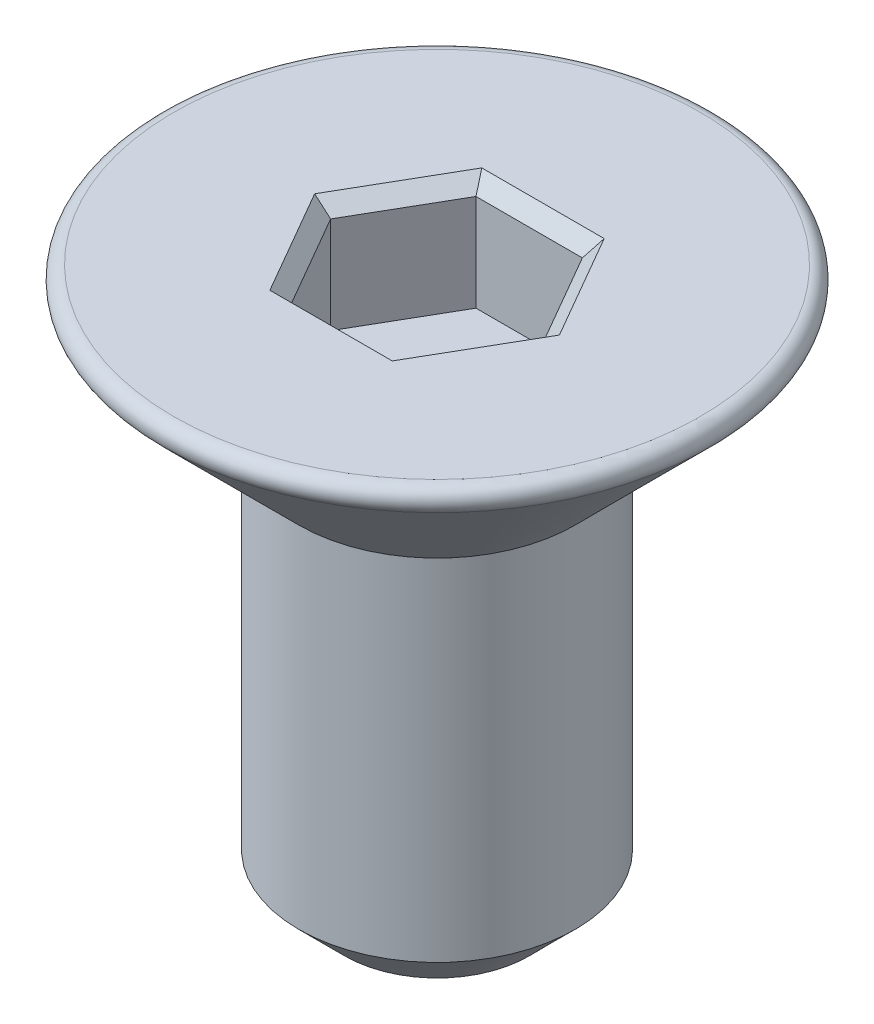
ISO-10303-21;
HEADER;
FILE_DESCRIPTION(('STEP AP214'),'2;1');
FILE_NAME('part.step','',(''),(''),'','','');
FILE_SCHEMA(('AUTOMOTIVE_DESIGN { 1 0 10303 214 1 1 1 1 }'));
ENDSEC;
DATA;
#1=APPLICATION_CONTEXT('core data for automotive mechanical design processes');
#2=APPLICATION_PROTOCOL_DEFINITION('international standard','automotive_design',2000,#1);
#3=PRODUCT_CONTEXT('',#1,'mechanical');
#4=PRODUCT('Part','Part','',(#3));
#5=PRODUCT_RELATED_PRODUCT_CATEGORY('part','',(#4));
#6=PRODUCT_DEFINITION_FORMATION('','',#4);
#7=PRODUCT_DEFINITION_CONTEXT('part definition',#1,'design');
#8=PRODUCT_DEFINITION('design','',#6,#7);
#9=PRODUCT_DEFINITION_SHAPE('','',#8);
#10=(LENGTH_UNIT() NAMED_UNIT(*) SI_UNIT(.MILLI.,.METRE.));
#11=(NAMED_UNIT(*) PLANE_ANGLE_UNIT() SI_UNIT($,.RADIAN.));
#12=(NAMED_UNIT(*) SI_UNIT($,.STERADIAN.) SOLID_ANGLE_UNIT());
#13=UNCERTAINTY_MEASURE_WITH_UNIT(LENGTH_MEASURE(1.E-05),#10,'distance_accuracy_value','');
#14=(GEOMETRIC_REPRESENTATION_CONTEXT(3) GLOBAL_UNCERTAINTY_ASSIGNED_CONTEXT((#13)) GLOBAL_UNIT_ASSIGNED_CONTEXT((#10,
#11,#12)) REPRESENTATION_CONTEXT('',''));
#15=CARTESIAN_POINT('',(0.,0.,0.));
#16=DIRECTION('',(0.,0.,1.));
#17=DIRECTION('',(1.,0.,0.));
#18=AXIS2_PLACEMENT_3D('',#15,#16,#17);
#19=CARTESIAN_POINT('',(0.,0.,0.));
#20=DIRECTION('',(0.,-1.,0.));
#21=DIRECTION('',(0.,0.,-1.));
#22=AXIS2_PLACEMENT_3D('',#19,#20,#21);
#23=PLANE('',#22);
#24=DIRECTION('',(-0.5,0.,-0.866025403784439));
#25=VECTOR('',#24,1.);
#26=CARTESIAN_POINT('',(-0.995929214352104,0.,0.575));
#27=LINE('',#26,#25);
#28=CARTESIAN_POINT('',(-0.663952809568069,0.,1.15));
#29=VERTEX_POINT('',#28);
#30=CARTESIAN_POINT('',(-1.32790561913614,0.,0.));
#31=VERTEX_POINT('',#30);
#32=EDGE_CURVE('E177',#29,#31,#27,.T.);
#33=ORIENTED_EDGE('',*,*,#32,.T.);
#34=DIRECTION('',(0.5,0.,-0.866025403784439));
#35=VECTOR('',#34,1.);
#36=CARTESIAN_POINT('',(-0.995929214352104,0.,-0.575));
#37=LINE('',#36,#35);
#38=CARTESIAN_POINT('',(-0.663952809568069,0.,-1.15));
#39=VERTEX_POINT('',#38);
#40=EDGE_CURVE('E179',#31,#39,#37,.T.);
#41=ORIENTED_EDGE('',*,*,#40,.T.);
#42=DIRECTION('',(1.,0.,0.));
#43=VECTOR('',#42,1.);
#44=CARTESIAN_POINT('',(0.,0.,-1.15));
#45=LINE('',#44,#43);
#46=CARTESIAN_POINT('',(0.66395280956807,0.,-1.15));
#47=VERTEX_POINT('',#46);
#48=EDGE_CURVE('E169',#39,#47,#45,.T.);
#49=ORIENTED_EDGE('',*,*,#48,.T.);
#50=DIRECTION('',(0.5,0.,0.866025403784439));
#51=VECTOR('',#50,1.);
#52=CARTESIAN_POINT('',(0.995929214352105,0.,-0.575));
#53=LINE('',#52,#51);
#54=CARTESIAN_POINT('',(1.32790561913614,0.,0.));
#55=VERTEX_POINT('',#54);
#56=EDGE_CURVE('E171',#47,#55,#53,.T.);
#57=ORIENTED_EDGE('',*,*,#56,.T.);
#58=DIRECTION('',(-0.5,0.,0.866025403784439));
#59=VECTOR('',#58,1.);
#60=CARTESIAN_POINT('',(0.995929214352105,0.,0.575));
#61=LINE('',#60,#59);
#62=CARTESIAN_POINT('',(0.66395280956807,0.,1.15));
#63=VERTEX_POINT('',#62);
#64=EDGE_CURVE('E173',#55,#63,#61,.T.);
#65=ORIENTED_EDGE('',*,*,#64,.T.);
#66=DIRECTION('',(-1.,0.,0.));
#67=VECTOR('',#66,1.);
#68=CARTESIAN_POINT('',(0.,0.,1.15));
#69=LINE('',#68,#67);
#70=EDGE_CURVE('E175',#63,#29,#69,.T.);
#71=ORIENTED_EDGE('',*,*,#70,.T.);
#72=EDGE_LOOP('',(#33,#41,#49,#57,#65,#71));
#73=FACE_BOUND('',#72,.T.);
#74=CARTESIAN_POINT('',(0.,0.,0.));
#75=DIRECTION('',(0.,1.,0.));
#76=DIRECTION('',(0.,0.,1.));
#77=AXIS2_PLACEMENT_3D('',#74,#75,#76);
#78=CIRCLE('',#77,2.85857864376269);
#79=CARTESIAN_POINT('',(0.,0.,2.85857864376269));
#80=VERTEX_POINT('',#79);
#81=EDGE_CURVE('E165',#80,#80,#78,.T.);
#82=ORIENTED_EDGE('',*,*,#81,.T.);
#83=EDGE_LOOP('',(#82));
#84=FACE_BOUND('',#83,.T.);
#85=ADVANCED_FACE('F35',(#73,#84),#23,.F.);
#86=CARTESIAN_POINT('',(0.,-0.141421356237313,0.));
#87=DIRECTION('',(0.,1.,0.));
#88=DIRECTION('',(0.,0.,1.));
#89=AXIS2_PLACEMENT_3D('',#86,#87,#88);
#90=TOROIDAL_SURFACE('',#89,2.85857864376269,0.141421356237313);
#91=ORIENTED_EDGE('',*,*,#81,.F.);
#92=EDGE_LOOP('',(#91));
#93=FACE_BOUND('',#92,.T.);
#94=CARTESIAN_POINT('',(0.,-0.241421356237315,0.));
#95=DIRECTION('',(0.,1.,0.));
#96=DIRECTION('',(0.,0.,1.));
#97=AXIS2_PLACEMENT_3D('',#94,#95,#96);
#98=CIRCLE('',#97,2.95857864376269);
#99=CARTESIAN_POINT('',(0.,-0.241421356237315,2.95857864376269));
#100=VERTEX_POINT('',#99);
#101=EDGE_CURVE('E162',#100,#100,#98,.T.);
#102=ORIENTED_EDGE('',*,*,#101,.T.);
#103=EDGE_LOOP('',(#102));
#104=FACE_BOUND('',#103,.T.);
#105=ADVANCED_FACE('F233',(#93,#104),#90,.T.);
#106=CARTESIAN_POINT('',(0.,-1.7,0.));
#107=DIRECTION('',(0.,1.,0.));
#108=DIRECTION('',(0.,0.,1.));
#109=AXIS2_PLACEMENT_3D('',#106,#107,#108);
#110=CONICAL_SURFACE('',#109,1.5,0.78539816339745);
#111=ORIENTED_EDGE('',*,*,#101,.F.);
#112=EDGE_LOOP('',(#111));
#113=FACE_BOUND('',#112,.T.);
#114=CARTESIAN_POINT('',(0.,-1.7,0.));
#115=DIRECTION('',(0.,1.,0.));
#116=DIRECTION('',(0.,0.,1.));
#117=AXIS2_PLACEMENT_3D('',#114,#115,#116);
#118=CIRCLE('',#117,1.5);
#119=CARTESIAN_POINT('',(0.,-1.7,1.5));
#120=VERTEX_POINT('',#119);
#121=EDGE_CURVE('E159',#120,#120,#118,.T.);
#122=ORIENTED_EDGE('',*,*,#121,.T.);
#123=EDGE_LOOP('',(#122));
#124=FACE_BOUND('',#123,.T.);
#125=ADVANCED_FACE('F239',(#113,#124),#110,.T.);
#126=CARTESIAN_POINT('',(0.,6.97297297297297,0.));
#127=DIRECTION('',(0.,1.,0.));
#128=DIRECTION('',(0.,0.,1.));
#129=AXIS2_PLACEMENT_3D('',#126,#127,#128);
#130=CYLINDRICAL_SURFACE('',#129,1.5);
#131=ORIENTED_EDGE('',*,*,#121,.F.);
#132=EDGE_LOOP('',(#131));
#133=FACE_BOUND('',#132,.T.);
#134=CARTESIAN_POINT('',(0.,-5.5,0.));
#135=DIRECTION('',(0.,1.,0.));
#136=DIRECTION('',(0.,0.,1.));
#137=AXIS2_PLACEMENT_3D('',#134,#135,#136);
#138=CIRCLE('',#137,1.5);
#139=CARTESIAN_POINT('',(0.,-5.5,1.5));
#140=VERTEX_POINT('',#139);
#141=EDGE_CURVE('E156',#140,#140,#138,.T.);
#142=ORIENTED_EDGE('',*,*,#141,.T.);
#143=EDGE_LOOP('',(#142));
#144=FACE_BOUND('',#143,.T.);
#145=ADVANCED_FACE('F360',(#133,#144),#130,.T.);
#146=CARTESIAN_POINT('',(0.,-6.,0.));
#147=DIRECTION('',(0.,1.,0.));
#148=DIRECTION('',(0.,0.,1.));
#149=AXIS2_PLACEMENT_3D('',#146,#147,#148);
#150=CONICAL_SURFACE('',#149,1.,0.785398163397448);
#151=ORIENTED_EDGE('',*,*,#141,.F.);
#152=EDGE_LOOP('',(#151));
#153=FACE_BOUND('',#152,.T.);
#154=CARTESIAN_POINT('',(0.,-6.,0.));
#155=DIRECTION('',(0.,1.,0.));
#156=DIRECTION('',(0.,0.,1.));
#157=AXIS2_PLACEMENT_3D('',#154,#155,#156);
#158=CIRCLE('',#157,1.);
#159=CARTESIAN_POINT('',(0.,-6.,1.));
#160=VERTEX_POINT('',#159);
#161=EDGE_CURVE('E146',#160,#160,#158,.T.);
#162=ORIENTED_EDGE('',*,*,#161,.T.);
#163=EDGE_LOOP('',(#162));
#164=FACE_BOUND('',#163,.T.);
#165=ADVANCED_FACE('F355',(#153,#164),#150,.T.);
#166=CARTESIAN_POINT('',(1.,-6.,0.));
#167=DIRECTION('',(0.,1.,0.));
#168=DIRECTION('',(0.,0.,1.));
#169=AXIS2_PLACEMENT_3D('',#166,#167,#168);
#170=PLANE('',#169);
#171=ORIENTED_EDGE('',*,*,#161,.F.);
#172=EDGE_LOOP('',(#171));
#173=FACE_BOUND('',#172,.T.);
#174=ADVANCED_FACE('F330',(#173),#170,.F.);
#175=CARTESIAN_POINT('',(-0.577350269189626,-1.2,-1.));
#176=DIRECTION('',(-0.866025403784439,0.,-0.5));
#177=DIRECTION('',(-0.5,0.,0.866025403784439));
#178=AXIS2_PLACEMENT_3D('',#175,#176,#177);
#179=PLANE('',#178);
#180=DIRECTION('',(0.,1.,0.));
#181=VECTOR('',#180,1.);
#182=CARTESIAN_POINT('',(-0.577350269189626,-1.2,-1.));
#183=LINE('',#182,#181);
#184=CARTESIAN_POINT('',(-0.577350269189626,-1.2,-1.));
#185=VERTEX_POINT('',#184);
#186=CARTESIAN_POINT('',(-0.577350269189626,-0.15,-1.));
#187=VERTEX_POINT('',#186);
#188=EDGE_CURVE('E144',#185,#187,#183,.T.);
#189=ORIENTED_EDGE('',*,*,#188,.T.);
#190=DIRECTION('',(-0.5,0.,0.866025403784439));
#191=VECTOR('',#190,1.);
#192=CARTESIAN_POINT('',(-0.577350269189626,-0.15,-1.));
#193=LINE('',#192,#191);
#194=CARTESIAN_POINT('',(-1.15470053837925,-0.15,0.));
#195=VERTEX_POINT('',#194);
#196=EDGE_CURVE('E116',#187,#195,#193,.T.);
#197=ORIENTED_EDGE('',*,*,#196,.T.);
#198=DIRECTION('',(0.,1.,0.));
#199=VECTOR('',#198,1.);
#200=CARTESIAN_POINT('',(-1.15470053837925,-1.2,0.));
#201=LINE('',#200,#199);
#202=CARTESIAN_POINT('',(-1.15470053837925,-1.2,0.));
#203=VERTEX_POINT('',#202);
#204=EDGE_CURVE('E108',#203,#195,#201,.T.);
#205=ORIENTED_EDGE('',*,*,#204,.F.);
#206=DIRECTION('',(-0.5,0.,0.866025403784439));
#207=VECTOR('',#206,1.);
#208=CARTESIAN_POINT('',(-0.577350269189626,-1.2,-1.));
#209=LINE('',#208,#207);
#210=EDGE_CURVE('E113',#185,#203,#209,.T.);
#211=ORIENTED_EDGE('',*,*,#210,.F.);
#212=EDGE_LOOP('',(#189,#197,#205,#211));
#213=FACE_BOUND('',#212,.T.);
#214=ADVANCED_FACE('F111',(#213),#179,.F.);
#215=CARTESIAN_POINT('',(0.577350269189626,-1.2,-1.));
#216=DIRECTION('',(0.,0.,-1.));
#217=DIRECTION('',(-1.,0.,0.));
#218=AXIS2_PLACEMENT_3D('',#215,#216,#217);
#219=PLANE('',#218);
#220=DIRECTION('',(0.,1.,0.));
#221=VECTOR('',#220,1.);
#222=CARTESIAN_POINT('',(0.577350269189626,-1.2,-1.));
#223=LINE('',#222,#221);
#224=CARTESIAN_POINT('',(0.577350269189626,-1.2,-1.));
#225=VERTEX_POINT('',#224);
#226=CARTESIAN_POINT('',(0.577350269189626,-0.15,-1.));
#227=VERTEX_POINT('',#226);
#228=EDGE_CURVE('E147',#225,#227,#223,.T.);
#229=ORIENTED_EDGE('',*,*,#228,.T.);
#230=DIRECTION('',(-1.,0.,0.));
#231=VECTOR('',#230,1.);
#232=CARTESIAN_POINT('',(0.577350269189626,-0.15,-1.));
#233=LINE('',#232,#231);
#234=EDGE_CURVE('E11',#227,#187,#233,.T.);
#235=ORIENTED_EDGE('',*,*,#234,.T.);
#236=ORIENTED_EDGE('',*,*,#188,.F.);
#237=DIRECTION('',(-1.,0.,0.));
#238=VECTOR('',#237,1.);
#239=CARTESIAN_POINT('',(0.577350269189626,-1.2,-1.));
#240=LINE('',#239,#238);
#241=EDGE_CURVE('E119',#225,#185,#240,.T.);
#242=ORIENTED_EDGE('',*,*,#241,.F.);
#243=EDGE_LOOP('',(#229,#235,#236,#242));
#244=FACE_BOUND('',#243,.T.);
#245=ADVANCED_FACE('F217',(#244),#219,.F.);
#246=CARTESIAN_POINT('',(1.15470053837925,-1.2,0.));
#247=DIRECTION('',(0.866025403784439,0.,-0.5));
#248=DIRECTION('',(-0.5,0.,-0.866025403784439));
#249=AXIS2_PLACEMENT_3D('',#246,#247,#248);
#250=PLANE('',#249);
#251=DIRECTION('',(0.,1.,0.));
#252=VECTOR('',#251,1.);
#253=CARTESIAN_POINT('',(1.15470053837925,-1.2,0.));
#254=LINE('',#253,#252);
#255=CARTESIAN_POINT('',(1.15470053837925,-1.2,0.));
#256=VERTEX_POINT('',#255);
#257=CARTESIAN_POINT('',(1.15470053837925,-0.15,0.));
#258=VERTEX_POINT('',#257);
#259=EDGE_CURVE('E149',#256,#258,#254,.T.);
#260=ORIENTED_EDGE('',*,*,#259,.T.);
#261=DIRECTION('',(-0.5,0.,-0.866025403784439));
#262=VECTOR('',#261,1.);
#263=CARTESIAN_POINT('',(1.15470053837925,-0.15,0.));
#264=LINE('',#263,#262);
#265=EDGE_CURVE('E44',#258,#227,#264,.T.);
#266=ORIENTED_EDGE('',*,*,#265,.T.);
#267=ORIENTED_EDGE('',*,*,#228,.F.);
#268=DIRECTION('',(-0.5,0.,-0.866025403784439));
#269=VECTOR('',#268,1.);
#270=CARTESIAN_POINT('',(1.15470053837925,-1.2,0.));
#271=LINE('',#270,#269);
#272=EDGE_CURVE('E141',#256,#225,#271,.T.);
#273=ORIENTED_EDGE('',*,*,#272,.F.);
#274=EDGE_LOOP('',(#260,#266,#267,#273));
#275=FACE_BOUND('',#274,.T.);
#276=ADVANCED_FACE('F219',(#275),#250,.F.);
#277=CARTESIAN_POINT('',(0.577350269189626,-1.2,1.));
#278=DIRECTION('',(0.866025403784439,0.,0.5));
#279=DIRECTION('',(0.5,0.,-0.866025403784439));
#280=AXIS2_PLACEMENT_3D('',#277,#278,#279);
#281=PLANE('',#280);
#282=DIRECTION('',(0.,1.,0.));
#283=VECTOR('',#282,1.);
#284=CARTESIAN_POINT('',(0.577350269189626,-1.2,1.));
#285=LINE('',#284,#283);
#286=CARTESIAN_POINT('',(0.577350269189626,-1.2,1.));
#287=VERTEX_POINT('',#286);
#288=CARTESIAN_POINT('',(0.577350269189626,-0.15,1.));
#289=VERTEX_POINT('',#288);
#290=EDGE_CURVE('E151',#287,#289,#285,.T.);
#291=ORIENTED_EDGE('',*,*,#290,.T.);
#292=DIRECTION('',(0.5,0.,-0.866025403784439));
#293=VECTOR('',#292,1.);
#294=CARTESIAN_POINT('',(0.577350269189626,-0.15,1.));
#295=LINE('',#294,#293);
#296=EDGE_CURVE('E59',#289,#258,#295,.T.);
#297=ORIENTED_EDGE('',*,*,#296,.T.);
#298=ORIENTED_EDGE('',*,*,#259,.F.);
#299=DIRECTION('',(0.5,0.,-0.866025403784439));
#300=VECTOR('',#299,1.);
#301=CARTESIAN_POINT('',(0.577350269189626,-1.2,1.));
#302=LINE('',#301,#300);
#303=EDGE_CURVE('E138',#287,#256,#302,.T.);
#304=ORIENTED_EDGE('',*,*,#303,.F.);
#305=EDGE_LOOP('',(#291,#297,#298,#304));
#306=FACE_BOUND('',#305,.T.);
#307=ADVANCED_FACE('F221',(#306),#281,.F.);
#308=CARTESIAN_POINT('',(-0.577350269189626,-1.2,1.));
#309=DIRECTION('',(0.,0.,1.));
#310=DIRECTION('',(1.,0.,0.));
#311=AXIS2_PLACEMENT_3D('',#308,#309,#310);
#312=PLANE('',#311);
#313=DIRECTION('',(0.,1.,0.));
#314=VECTOR('',#313,1.);
#315=CARTESIAN_POINT('',(-0.577350269189626,-1.2,1.));
#316=LINE('',#315,#314);
#317=CARTESIAN_POINT('',(-0.577350269189626,-1.2,1.));
#318=VERTEX_POINT('',#317);
#319=CARTESIAN_POINT('',(-0.577350269189626,-0.15,1.));
#320=VERTEX_POINT('',#319);
#321=EDGE_CURVE('E118',#318,#320,#316,.T.);
#322=ORIENTED_EDGE('',*,*,#321,.T.);
#323=DIRECTION('',(1.,0.,0.));
#324=VECTOR('',#323,1.);
#325=CARTESIAN_POINT('',(-0.577350269189626,-0.15,1.));
#326=LINE('',#325,#324);
#327=EDGE_CURVE('E184',#320,#289,#326,.T.);
#328=ORIENTED_EDGE('',*,*,#327,.T.);
#329=ORIENTED_EDGE('',*,*,#290,.F.);
#330=DIRECTION('',(1.,0.,0.));
#331=VECTOR('',#330,1.);
#332=CARTESIAN_POINT('',(-0.577350269189626,-1.2,1.));
#333=LINE('',#332,#331);
#334=EDGE_CURVE('E128',#318,#287,#333,.T.);
#335=ORIENTED_EDGE('',*,*,#334,.F.);
#336=EDGE_LOOP('',(#322,#328,#329,#335));
#337=FACE_BOUND('',#336,.T.);
#338=ADVANCED_FACE('F223',(#337),#312,.F.);
#339=CARTESIAN_POINT('',(-1.15470053837925,-1.2,0.));
#340=DIRECTION('',(-0.866025403784439,0.,0.5));
#341=DIRECTION('',(0.5,0.,0.866025403784439));
#342=AXIS2_PLACEMENT_3D('',#339,#340,#341);
#343=PLANE('',#342);
#344=ORIENTED_EDGE('',*,*,#204,.T.);
#345=DIRECTION('',(0.5,0.,0.866025403784439));
#346=VECTOR('',#345,1.);
#347=CARTESIAN_POINT('',(-1.15470053837925,-0.15,0.));
#348=LINE('',#347,#346);
#349=EDGE_CURVE('E182',#195,#320,#348,.T.);
#350=ORIENTED_EDGE('',*,*,#349,.T.);
#351=ORIENTED_EDGE('',*,*,#321,.F.);
#352=DIRECTION('',(0.5,0.,0.866025403784439));
#353=VECTOR('',#352,1.);
#354=CARTESIAN_POINT('',(-1.15470053837925,-1.2,0.));
#355=LINE('',#354,#353);
#356=EDGE_CURVE('E122',#203,#318,#355,.T.);
#357=ORIENTED_EDGE('',*,*,#356,.F.);
#358=EDGE_LOOP('',(#344,#350,#351,#357));
#359=FACE_BOUND('',#358,.T.);
#360=ADVANCED_FACE('F123',(#359),#343,.F.);
#361=CARTESIAN_POINT('',(0.,-1.2,0.));
#362=DIRECTION('',(0.,1.,0.));
#363=DIRECTION('',(0.,0.,1.));
#364=AXIS2_PLACEMENT_3D('',#361,#362,#363);
#365=PLANE('',#364);
#366=ORIENTED_EDGE('',*,*,#210,.T.);
#367=ORIENTED_EDGE('',*,*,#356,.T.);
#368=ORIENTED_EDGE('',*,*,#334,.T.);
#369=ORIENTED_EDGE('',*,*,#303,.T.);
#370=ORIENTED_EDGE('',*,*,#272,.T.);
#371=ORIENTED_EDGE('',*,*,#241,.T.);
#372=EDGE_LOOP('',(#366,#367,#368,#369,#370,#371));
#373=FACE_BOUND('',#372,.T.);
#374=ADVANCED_FACE('F130',(#373),#365,.T.);
#375=CARTESIAN_POINT('',(0.577350269189626,-0.15,1.));
#376=DIRECTION('',(0.612372435695795,-0.707106781186547,0.353553390593274));
#377=DIRECTION('',(0.5,0.,-0.866025403784439));
#378=AXIS2_PLACEMENT_3D('',#375,#376,#377);
#379=PLANE('',#378);
#380=DIRECTION('',(0.377964473009227,0.654653670707977,0.654653670707977));
#381=VECTOR('',#380,1.);
#382=CARTESIAN_POINT('',(0.412393049421162,-0.435714285714285,0.714285714285715));
#383=LINE('',#382,#381);
#384=EDGE_CURVE('E135',#63,#289,#383,.F.);
#385=ORIENTED_EDGE('',*,*,#384,.F.);
#386=ORIENTED_EDGE('',*,*,#64,.F.);
#387=DIRECTION('',(0.755928946018454,0.654653670707978,0.));
#388=VECTOR('',#387,1.);
#389=CARTESIAN_POINT('',(0.824786098842324,-0.435714285714286,0.));
#390=LINE('',#389,#388);
#391=EDGE_CURVE('E39',#258,#55,#390,.T.);
#392=ORIENTED_EDGE('',*,*,#391,.F.);
#393=ORIENTED_EDGE('',*,*,#296,.F.);
#394=EDGE_LOOP('',(#385,#386,#392,#393));
#395=FACE_BOUND('',#394,.T.);
#396=ADVANCED_FACE('F37',(#395),#379,.F.);
#397=CARTESIAN_POINT('',(1.15470053837925,-0.15,0.));
#398=DIRECTION('',(0.612372435695795,-0.707106781186547,-0.353553390593274));
#399=DIRECTION('',(-0.5,0.,-0.866025403784439));
#400=AXIS2_PLACEMENT_3D('',#397,#398,#399);
#401=PLANE('',#400);
#402=ORIENTED_EDGE('',*,*,#391,.T.);
#403=ORIENTED_EDGE('',*,*,#56,.F.);
#404=DIRECTION('',(0.377964473009227,0.654653670707978,-0.654653670707977));
#405=VECTOR('',#404,1.);
#406=CARTESIAN_POINT('',(0.412393049421162,-0.435714285714286,-0.714285714285715));
#407=LINE('',#406,#405);
#408=EDGE_CURVE('E195',#227,#47,#407,.T.);
#409=ORIENTED_EDGE('',*,*,#408,.F.);
#410=ORIENTED_EDGE('',*,*,#265,.F.);
#411=EDGE_LOOP('',(#402,#403,#409,#410));
#412=FACE_BOUND('',#411,.T.);
#413=ADVANCED_FACE('F210',(#412),#401,.F.);
#414=CARTESIAN_POINT('',(-0.577350269189626,-0.15,1.));
#415=DIRECTION('',(0.,-0.707106781186547,0.707106781186547));
#416=DIRECTION('',(1.,0.,0.));
#417=AXIS2_PLACEMENT_3D('',#414,#415,#416);
#418=PLANE('',#417);
#419=ORIENTED_EDGE('',*,*,#384,.T.);
#420=ORIENTED_EDGE('',*,*,#327,.F.);
#421=DIRECTION('',(-0.377964473009227,0.654653670707977,0.654653670707977));
#422=VECTOR('',#421,1.);
#423=CARTESIAN_POINT('',(-0.412393049421161,-0.435714285714286,0.714285714285715));
#424=LINE('',#423,#422);
#425=EDGE_CURVE('E192',#29,#320,#424,.F.);
#426=ORIENTED_EDGE('',*,*,#425,.F.);
#427=ORIENTED_EDGE('',*,*,#70,.F.);
#428=EDGE_LOOP('',(#419,#420,#426,#427));
#429=FACE_BOUND('',#428,.T.);
#430=ADVANCED_FACE('F202',(#429),#418,.F.);
#431=CARTESIAN_POINT('',(0.577350269189626,-0.15,-1.));
#432=DIRECTION('',(0.,-0.707106781186547,-0.707106781186548));
#433=DIRECTION('',(-1.,0.,0.));
#434=AXIS2_PLACEMENT_3D('',#431,#432,#433);
#435=PLANE('',#434);
#436=ORIENTED_EDGE('',*,*,#408,.T.);
#437=ORIENTED_EDGE('',*,*,#48,.F.);
#438=DIRECTION('',(0.377964473009228,-0.654653670707977,0.654653670707977));
#439=VECTOR('',#438,1.);
#440=CARTESIAN_POINT('',(-0.577350269189626,-0.15,-1.));
#441=LINE('',#440,#439);
#442=EDGE_CURVE('E190',#187,#39,#441,.F.);
#443=ORIENTED_EDGE('',*,*,#442,.F.);
#444=ORIENTED_EDGE('',*,*,#234,.F.);
#445=EDGE_LOOP('',(#436,#437,#443,#444));
#446=FACE_BOUND('',#445,.T.);
#447=ADVANCED_FACE('F215',(#446),#435,.F.);
#448=CARTESIAN_POINT('',(-1.15470053837925,-0.15,0.));
#449=DIRECTION('',(-0.612372435695795,-0.707106781186547,0.353553390593274));
#450=DIRECTION('',(0.5,0.,0.866025403784439));
#451=AXIS2_PLACEMENT_3D('',#448,#449,#450);
#452=PLANE('',#451);
#453=ORIENTED_EDGE('',*,*,#425,.T.);
#454=ORIENTED_EDGE('',*,*,#349,.F.);
#455=DIRECTION('',(-0.755928946018454,0.654653670707977,0.));
#456=VECTOR('',#455,1.);
#457=CARTESIAN_POINT('',(-0.824786098842322,-0.435714285714286,0.));
#458=LINE('',#457,#456);
#459=EDGE_CURVE('E188',#31,#195,#458,.F.);
#460=ORIENTED_EDGE('',*,*,#459,.F.);
#461=ORIENTED_EDGE('',*,*,#32,.F.);
#462=EDGE_LOOP('',(#453,#454,#460,#461));
#463=FACE_BOUND('',#462,.T.);
#464=ADVANCED_FACE('F248',(#463),#452,.F.);
#465=CARTESIAN_POINT('',(-0.577350269189626,-0.15,-1.));
#466=DIRECTION('',(-0.612372435695795,-0.707106781186547,-0.353553390593274));
#467=DIRECTION('',(-0.5,0.,0.866025403784439));
#468=AXIS2_PLACEMENT_3D('',#465,#466,#467);
#469=PLANE('',#468);
#470=ORIENTED_EDGE('',*,*,#442,.T.);
#471=ORIENTED_EDGE('',*,*,#40,.F.);
#472=ORIENTED_EDGE('',*,*,#459,.T.);
#473=ORIENTED_EDGE('',*,*,#196,.F.);
#474=EDGE_LOOP('',(#470,#471,#472,#473));
#475=FACE_BOUND('',#474,.T.);
#476=ADVANCED_FACE('F245',(#475),#469,.F.);
#477=CLOSED_SHELL('',(#85,#105,#125,#145,#165,#174,#214,#245,#276,#307,#338,#360,#374,#396,#413,
#430,#447,#464,#476));
#478=MANIFOLD_SOLID_BREP('B2',#477);
#479=ADVANCED_BREP_SHAPE_REPRESENTATION('',(#18,#478),#14);
#480=SHAPE_DEFINITION_REPRESENTATION(#9,#479);
ENDSEC;
END-ISO-10303-21;
